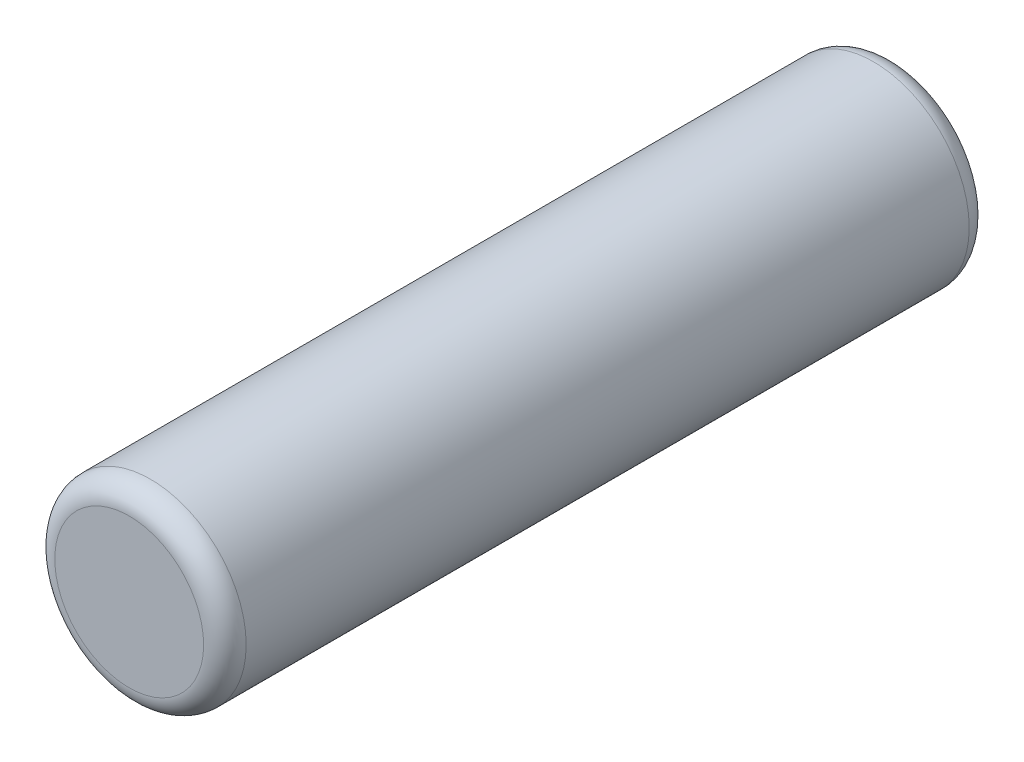
ISO-10303-21;
HEADER;
FILE_DESCRIPTION(('STEP AP214'),'2;1');
FILE_NAME('part.step','',(''),(''),'','','');
FILE_SCHEMA(('AUTOMOTIVE_DESIGN { 1 0 10303 214 1 1 1 1 }'));
ENDSEC;
DATA;
#1=APPLICATION_CONTEXT('core data for automotive mechanical design processes');
#2=APPLICATION_PROTOCOL_DEFINITION('international standard','automotive_design',2000,#1);
#3=PRODUCT_CONTEXT('',#1,'mechanical');
#4=PRODUCT('Part','Part','',(#3));
#5=PRODUCT_RELATED_PRODUCT_CATEGORY('part','',(#4));
#6=PRODUCT_DEFINITION_FORMATION('','',#4);
#7=PRODUCT_DEFINITION_CONTEXT('part definition',#1,'design');
#8=PRODUCT_DEFINITION('design','',#6,#7);
#9=PRODUCT_DEFINITION_SHAPE('','',#8);
#10=(LENGTH_UNIT() NAMED_UNIT(*) SI_UNIT(.MILLI.,.METRE.));
#11=(NAMED_UNIT(*) PLANE_ANGLE_UNIT() SI_UNIT($,.RADIAN.));
#12=(NAMED_UNIT(*) SI_UNIT($,.STERADIAN.) SOLID_ANGLE_UNIT());
#13=UNCERTAINTY_MEASURE_WITH_UNIT(LENGTH_MEASURE(1.E-05),#10,'distance_accuracy_value','');
#14=(GEOMETRIC_REPRESENTATION_CONTEXT(3) GLOBAL_UNCERTAINTY_ASSIGNED_CONTEXT((#13)) GLOBAL_UNIT_ASSIGNED_CONTEXT((#10,
#11,#12)) REPRESENTATION_CONTEXT('',''));
#15=CARTESIAN_POINT('',(0.,0.,0.));
#16=DIRECTION('',(0.,0.,1.));
#17=DIRECTION('',(1.,0.,0.));
#18=AXIS2_PLACEMENT_3D('',#15,#16,#17);
#19=CARTESIAN_POINT('',(0.,0.,457.2));
#20=DIRECTION('',(0.,0.,-1.));
#21=DIRECTION('',(-1.,0.,0.));
#22=AXIS2_PLACEMENT_3D('',#19,#20,#21);
#23=CYLINDRICAL_SURFACE('',#22,57.15);
#24=CARTESIAN_POINT('',(0.,0.,12.7));
#25=DIRECTION('',(0.,0.,1.));
#26=DIRECTION('',(1.,0.,0.));
#27=AXIS2_PLACEMENT_3D('',#24,#25,#26);
#28=CIRCLE('',#27,57.15);
#29=CARTESIAN_POINT('',(57.15,0.,12.7));
#30=VERTEX_POINT('',#29);
#31=EDGE_CURVE('E42',#30,#30,#28,.T.);
#32=ORIENTED_EDGE('',*,*,#31,.T.);
#33=EDGE_LOOP('',(#32));
#34=FACE_BOUND('',#33,.T.);
#35=CARTESIAN_POINT('',(0.,0.,444.5));
#36=DIRECTION('',(0.,0.,1.));
#37=DIRECTION('',(1.,0.,0.));
#38=AXIS2_PLACEMENT_3D('',#35,#36,#37);
#39=CIRCLE('',#38,57.15);
#40=CARTESIAN_POINT('',(57.15,0.,444.5));
#41=VERTEX_POINT('',#40);
#42=EDGE_CURVE('E46',#41,#41,#39,.F.);
#43=ORIENTED_EDGE('',*,*,#42,.T.);
#44=EDGE_LOOP('',(#43));
#45=FACE_BOUND('',#44,.T.);
#46=ADVANCED_FACE('F31',(#34,#45),#23,.T.);
#47=CARTESIAN_POINT('',(0.,0.,457.2));
#48=DIRECTION('',(0.,0.,1.));
#49=DIRECTION('',(1.,0.,0.));
#50=AXIS2_PLACEMENT_3D('',#47,#48,#49);
#51=PLANE('',#50);
#52=CARTESIAN_POINT('',(0.,0.,457.2));
#53=DIRECTION('',(0.,0.,1.));
#54=DIRECTION('',(1.,0.,0.));
#55=AXIS2_PLACEMENT_3D('',#52,#53,#54);
#56=CIRCLE('',#55,44.45);
#57=CARTESIAN_POINT('',(44.45,0.,457.2));
#58=VERTEX_POINT('',#57);
#59=EDGE_CURVE('E10',#58,#58,#56,.T.);
#60=ORIENTED_EDGE('',*,*,#59,.T.);
#61=EDGE_LOOP('',(#60));
#62=FACE_BOUND('',#61,.T.);
#63=ADVANCED_FACE('F62',(#62),#51,.T.);
#64=CARTESIAN_POINT('',(0.,0.,0.));
#65=DIRECTION('',(0.,0.,1.));
#66=DIRECTION('',(1.,0.,0.));
#67=AXIS2_PLACEMENT_3D('',#64,#65,#66);
#68=PLANE('',#67);
#69=CARTESIAN_POINT('',(0.,0.,0.));
#70=DIRECTION('',(0.,0.,1.));
#71=DIRECTION('',(1.,0.,0.));
#72=AXIS2_PLACEMENT_3D('',#69,#70,#71);
#73=CIRCLE('',#72,44.45);
#74=CARTESIAN_POINT('',(44.45,0.,0.));
#75=VERTEX_POINT('',#74);
#76=EDGE_CURVE('E38',#75,#75,#73,.F.);
#77=ORIENTED_EDGE('',*,*,#76,.T.);
#78=EDGE_LOOP('',(#77));
#79=FACE_BOUND('',#78,.T.);
#80=ADVANCED_FACE('F59',(#79),#68,.F.);
#81=CARTESIAN_POINT('',(0.,0.,12.7));
#82=DIRECTION('',(0.,0.,1.));
#83=DIRECTION('',(1.,0.,0.));
#84=AXIS2_PLACEMENT_3D('',#81,#82,#83);
#85=TOROIDAL_SURFACE('',#84,44.45,12.7);
#86=ORIENTED_EDGE('',*,*,#76,.F.);
#87=EDGE_LOOP('',(#86));
#88=FACE_BOUND('',#87,.T.);
#89=ORIENTED_EDGE('',*,*,#31,.F.);
#90=EDGE_LOOP('',(#89));
#91=FACE_BOUND('',#90,.T.);
#92=ADVANCED_FACE('F55',(#88,#91),#85,.T.);
#93=CARTESIAN_POINT('',(0.,0.,444.5));
#94=DIRECTION('',(0.,0.,1.));
#95=DIRECTION('',(1.,0.,0.));
#96=AXIS2_PLACEMENT_3D('',#93,#94,#95);
#97=TOROIDAL_SURFACE('',#96,44.45,12.7);
#98=ORIENTED_EDGE('',*,*,#42,.F.);
#99=EDGE_LOOP('',(#98));
#100=FACE_BOUND('',#99,.T.);
#101=ORIENTED_EDGE('',*,*,#59,.F.);
#102=EDGE_LOOP('',(#101));
#103=FACE_BOUND('',#102,.T.);
#104=ADVANCED_FACE('F33',(#100,#103),#97,.T.);
#105=CLOSED_SHELL('',(#46,#63,#80,#92,#104));
#106=MANIFOLD_SOLID_BREP('B2',#105);
#107=ADVANCED_BREP_SHAPE_REPRESENTATION('',(#18,#106),#14);
#108=SHAPE_DEFINITION_REPRESENTATION(#9,#107);
ENDSEC;
END-ISO-10303-21;
